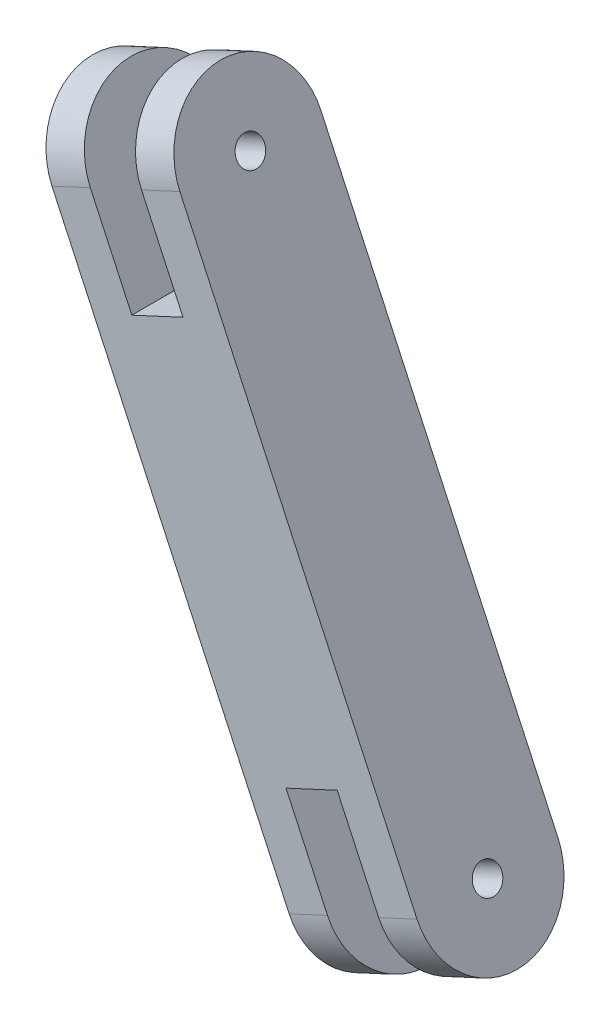
ISO-10303-21;
HEADER;
FILE_DESCRIPTION(('STEP AP214'),'2;1');
FILE_NAME('part.step','',(''),(''),'','','');
FILE_SCHEMA(('AUTOMOTIVE_DESIGN { 1 0 10303 214 1 1 1 1 }'));
ENDSEC;
DATA;
#1=APPLICATION_CONTEXT('core data for automotive mechanical design processes');
#2=APPLICATION_PROTOCOL_DEFINITION('international standard','automotive_design',2000,#1);
#3=PRODUCT_CONTEXT('',#1,'mechanical');
#4=PRODUCT('Part','Part','',(#3));
#5=PRODUCT_RELATED_PRODUCT_CATEGORY('part','',(#4));
#6=PRODUCT_DEFINITION_FORMATION('','',#4);
#7=PRODUCT_DEFINITION_CONTEXT('part definition',#1,'design');
#8=PRODUCT_DEFINITION('design','',#6,#7);
#9=PRODUCT_DEFINITION_SHAPE('','',#8);
#10=(LENGTH_UNIT() NAMED_UNIT(*) SI_UNIT(.MILLI.,.METRE.));
#11=(NAMED_UNIT(*) PLANE_ANGLE_UNIT() SI_UNIT($,.RADIAN.));
#12=(NAMED_UNIT(*) SI_UNIT($,.STERADIAN.) SOLID_ANGLE_UNIT());
#13=UNCERTAINTY_MEASURE_WITH_UNIT(LENGTH_MEASURE(1.E-05),#10,'distance_accuracy_value','');
#14=(GEOMETRIC_REPRESENTATION_CONTEXT(3) GLOBAL_UNCERTAINTY_ASSIGNED_CONTEXT((#13)) GLOBAL_UNIT_ASSIGNED_CONTEXT((#10,
#11,#12)) REPRESENTATION_CONTEXT('',''));
#15=CARTESIAN_POINT('',(0.,0.,0.));
#16=DIRECTION('',(0.,0.,1.));
#17=DIRECTION('',(1.,0.,0.));
#18=AXIS2_PLACEMENT_3D('',#15,#16,#17);
#19=CARTESIAN_POINT('',(-32.9102927291765,-15.2557675524765,10.));
#20=DIRECTION('',(0.907261631256998,0.420566680145837,0.));
#21=DIRECTION('',(-0.420566680145837,0.907261631256998,0.));
#22=AXIS2_PLACEMENT_3D('',#19,#20,#21);
#23=PLANE('',#22);
#24=CARTESIAN_POINT('',(-76.5968103404027,78.9863659854316,5.00000000000001));
#25=DIRECTION('',(0.907261631256998,0.420566680145837,0.));
#26=DIRECTION('',(-0.420566680145837,0.907261631256998,0.));
#27=AXIS2_PLACEMENT_3D('',#24,#25,#26);
#28=CIRCLE('',#27,1.);
#29=CARTESIAN_POINT('',(-77.0173770205486,79.8936276166886,5.00000000000001));
#30=VERTEX_POINT('',#29);
#31=EDGE_CURVE('E230',#30,#30,#28,.T.);
#32=ORIENTED_EDGE('',*,*,#31,.T.);
#33=EDGE_LOOP('',(#32));
#34=FACE_BOUND('',#33,.T.);
#35=CARTESIAN_POINT('',(-76.5968103404027,78.9863659854316,5.00000000000001));
#36=DIRECTION('',(0.907261631256998,0.420566680145837,0.));
#37=DIRECTION('',(-0.420566680145837,0.907261631256998,0.));
#38=AXIS2_PLACEMENT_3D('',#35,#36,#37);
#39=CIRCLE('',#38,5.);
#40=CARTESIAN_POINT('',(-76.5968103404028,78.9863659854317,10.));
#41=VERTEX_POINT('',#40);
#42=CARTESIAN_POINT('',(-76.5968103404027,78.9863659854316,0.));
#43=VERTEX_POINT('',#42);
#44=EDGE_CURVE('E120',#41,#43,#39,.T.);
#45=ORIENTED_EDGE('',*,*,#44,.F.);
#46=DIRECTION('',(0.420566680145837,-0.907261631256998,0.));
#47=VECTOR('',#46,1.);
#48=CARTESIAN_POINT('',(-32.9102927291765,-15.2557675524765,10.));
#49=LINE('',#48,#47);
#50=CARTESIAN_POINT('',(-79.5407771014236,85.3371974042306,10.));
#51=VERTEX_POINT('',#50);
#52=EDGE_CURVE('E293',#51,#41,#49,.T.);
#53=ORIENTED_EDGE('',*,*,#52,.F.);
#54=DIRECTION('',(0.,0.,-1.));
#55=VECTOR('',#54,1.);
#56=CARTESIAN_POINT('',(-79.5407771014236,85.3371974042306,10.));
#57=LINE('',#56,#55);
#58=CARTESIAN_POINT('',(-79.5407771014236,85.3371974042306,0.));
#59=VERTEX_POINT('',#58);
#60=EDGE_CURVE('E256',#51,#59,#57,.T.);
#61=ORIENTED_EDGE('',*,*,#60,.T.);
#62=DIRECTION('',(0.420566680145837,-0.907261631256998,0.));
#63=VECTOR('',#62,1.);
#64=CARTESIAN_POINT('',(-32.9102927291765,-15.2557675524765,0.));
#65=LINE('',#64,#63);
#66=EDGE_CURVE('E229',#59,#43,#65,.T.);
#67=ORIENTED_EDGE('',*,*,#66,.T.);
#68=EDGE_LOOP('',(#45,#53,#61,#67));
#69=FACE_BOUND('',#68,.T.);
#70=ADVANCED_FACE('F105',(#34,#69),#23,.F.);
#71=CARTESIAN_POINT('',(-30.1885078354055,-13.994067512039,10.));
#72=DIRECTION('',(0.907261631256998,0.420566680145837,0.));
#73=DIRECTION('',(-0.420566680145837,0.907261631256998,0.));
#74=AXIS2_PLACEMENT_3D('',#71,#72,#73);
#75=PLANE('',#74);
#76=CARTESIAN_POINT('',(-90.6976926524652,116.538531276149,5.));
#77=DIRECTION('',(0.907261631256998,0.420566680145837,0.));
#78=DIRECTION('',(-0.420566680145837,0.907261631256998,0.));
#79=AXIS2_PLACEMENT_3D('',#76,#77,#78);
#80=CIRCLE('',#79,0.999999999999995);
#81=CARTESIAN_POINT('',(-91.1182593326111,117.445792907406,5.));
#82=VERTEX_POINT('',#81);
#83=EDGE_CURVE('E314',#82,#82,#80,.T.);
#84=ORIENTED_EDGE('',*,*,#83,.F.);
#85=EDGE_LOOP('',(#84));
#86=FACE_BOUND('',#85,.T.);
#87=CARTESIAN_POINT('',(-73.8750254466317,80.2480660258691,5.00000000000001));
#88=DIRECTION('',(0.907261631256998,0.420566680145837,0.));
#89=DIRECTION('',(-0.420566680145837,0.907261631256998,0.));
#90=AXIS2_PLACEMENT_3D('',#87,#88,#89);
#91=CIRCLE('',#90,1.);
#92=CARTESIAN_POINT('',(-74.2955921267776,81.1553276571261,5.00000000000001));
#93=VERTEX_POINT('',#92);
#94=EDGE_CURVE('E267',#93,#93,#91,.T.);
#95=ORIENTED_EDGE('',*,*,#94,.F.);
#96=EDGE_LOOP('',(#95));
#97=FACE_BOUND('',#96,.T.);
#98=CARTESIAN_POINT('',(-90.6976926524652,116.538531276149,5.));
#99=DIRECTION('',(0.907261631256998,0.420566680145837,0.));
#100=DIRECTION('',(-0.420566680145837,0.907261631256998,0.));
#101=AXIS2_PLACEMENT_3D('',#98,#99,#100);
#102=CIRCLE('',#101,5.);
#103=CARTESIAN_POINT('',(-90.6976926524652,116.538531276149,0.));
#104=VERTEX_POINT('',#103);
#105=CARTESIAN_POINT('',(-90.6976926524652,116.538531276149,10.));
#106=VERTEX_POINT('',#105);
#107=EDGE_CURVE('E128',#104,#106,#102,.T.);
#108=ORIENTED_EDGE('',*,*,#107,.T.);
#109=DIRECTION('',(0.420566680145837,-0.907261631256998,0.));
#110=VECTOR('',#109,1.);
#111=CARTESIAN_POINT('',(-30.1885078354055,-13.994067512039,10.));
#112=LINE('',#111,#110);
#113=CARTESIAN_POINT('',(-73.8750254466317,80.2480660258692,10.));
#114=VERTEX_POINT('',#113);
#115=EDGE_CURVE('E290',#106,#114,#112,.T.);
#116=ORIENTED_EDGE('',*,*,#115,.T.);
#117=CARTESIAN_POINT('',(-73.8750254466317,80.2480660258691,5.00000000000001));
#118=DIRECTION('',(0.907261631256998,0.420566680145837,0.));
#119=DIRECTION('',(-0.420566680145837,0.907261631256998,0.));
#120=AXIS2_PLACEMENT_3D('',#117,#118,#119);
#121=CIRCLE('',#120,5.);
#122=CARTESIAN_POINT('',(-73.8750254466317,80.2480660258692,0.));
#123=VERTEX_POINT('',#122);
#124=EDGE_CURVE('E307',#114,#123,#121,.T.);
#125=ORIENTED_EDGE('',*,*,#124,.T.);
#126=DIRECTION('',(0.420566680145837,-0.907261631256998,0.));
#127=VECTOR('',#126,1.);
#128=CARTESIAN_POINT('',(-30.1885078354055,-13.994067512039,0.));
#129=LINE('',#128,#127);
#130=EDGE_CURVE('E233',#104,#123,#129,.T.);
#131=ORIENTED_EDGE('',*,*,#130,.F.);
#132=EDGE_LOOP('',(#108,#116,#125,#131));
#133=FACE_BOUND('',#132,.T.);
#134=ADVANCED_FACE('F359',(#86,#97,#133),#75,.T.);
#135=CARTESIAN_POINT('',(-32.9102927291764,-15.2557675524765,10.));
#136=DIRECTION('',(-0.907261631256998,-0.420566680145837,0.));
#137=DIRECTION('',(0.420566680145837,-0.907261631256998,0.));
#138=AXIS2_PLACEMENT_3D('',#135,#136,#137);
#139=PLANE('',#138);
#140=CARTESIAN_POINT('',(-93.4194775462362,115.276831235712,5.));
#141=DIRECTION('',(-0.907261631256998,-0.420566680145837,0.));
#142=DIRECTION('',(0.420566680145837,-0.907261631256998,0.));
#143=AXIS2_PLACEMENT_3D('',#140,#141,#142);
#144=CIRCLE('',#143,0.999999999999995);
#145=CARTESIAN_POINT('',(-92.9989108660904,114.369569604455,5.));
#146=VERTEX_POINT('',#145);
#147=EDGE_CURVE('E318',#146,#146,#144,.T.);
#148=ORIENTED_EDGE('',*,*,#147,.F.);
#149=EDGE_LOOP('',(#148));
#150=FACE_BOUND('',#149,.T.);
#151=DIRECTION('',(-0.420566680145837,0.907261631256998,0.));
#152=VECTOR('',#151,1.);
#153=CARTESIAN_POINT('',(-32.9102927291764,-15.2557675524765,10.));
#154=LINE('',#153,#152);
#155=CARTESIAN_POINT('',(-90.4755107852153,108.925999816913,10.));
#156=VERTEX_POINT('',#155);
#157=CARTESIAN_POINT('',(-93.4194775462362,115.276831235712,10.));
#158=VERTEX_POINT('',#157);
#159=EDGE_CURVE('E280',#156,#158,#154,.T.);
#160=ORIENTED_EDGE('',*,*,#159,.T.);
#161=CARTESIAN_POINT('',(-93.4194775462362,115.276831235712,5.));
#162=DIRECTION('',(-0.907261631256998,-0.420566680145837,0.));
#163=DIRECTION('',(0.420566680145837,-0.907261631256998,0.));
#164=AXIS2_PLACEMENT_3D('',#161,#162,#163);
#165=CIRCLE('',#164,5.);
#166=CARTESIAN_POINT('',(-93.4194775462362,115.276831235712,0.));
#167=VERTEX_POINT('',#166);
#168=EDGE_CURVE('E272',#158,#167,#165,.T.);
#169=ORIENTED_EDGE('',*,*,#168,.T.);
#170=DIRECTION('',(-0.420566680145837,0.907261631256998,0.));
#171=VECTOR('',#170,1.);
#172=CARTESIAN_POINT('',(-32.9102927291764,-15.2557675524765,0.));
#173=LINE('',#172,#171);
#174=CARTESIAN_POINT('',(-90.4755107852153,108.925999816913,0.));
#175=VERTEX_POINT('',#174);
#176=EDGE_CURVE('E236',#175,#167,#173,.T.);
#177=ORIENTED_EDGE('',*,*,#176,.F.);
#178=DIRECTION('',(0.,0.,-1.));
#179=VECTOR('',#178,1.);
#180=CARTESIAN_POINT('',(-90.4755107852153,108.925999816913,10.));
#181=LINE('',#180,#179);
#182=EDGE_CURVE('E254',#156,#175,#181,.T.);
#183=ORIENTED_EDGE('',*,*,#182,.F.);
#184=EDGE_LOOP('',(#160,#169,#177,#183));
#185=FACE_BOUND('',#184,.T.);
#186=ADVANCED_FACE('F278',(#150,#185),#139,.T.);
#187=CARTESIAN_POINT('',(-36.5393392542046,-16.9380342730599,10.));
#188=DIRECTION('',(0.907261631256998,0.420566680145837,0.));
#189=DIRECTION('',(-0.420566680145837,0.907261631256998,0.));
#190=AXIS2_PLACEMENT_3D('',#187,#188,#189);
#191=PLANE('',#190);
#192=CARTESIAN_POINT('',(-97.0485240712642,113.594564515128,5.));
#193=DIRECTION('',(0.907261631256998,0.420566680145837,0.));
#194=DIRECTION('',(-0.420566680145837,0.907261631256998,0.));
#195=AXIS2_PLACEMENT_3D('',#192,#193,#194);
#196=CIRCLE('',#195,0.999999999999995);
#197=CARTESIAN_POINT('',(-97.4690907514101,114.501826146385,5.));
#198=VERTEX_POINT('',#197);
#199=EDGE_CURVE('E321',#198,#198,#196,.T.);
#200=ORIENTED_EDGE('',*,*,#199,.F.);
#201=EDGE_LOOP('',(#200));
#202=FACE_BOUND('',#201,.T.);
#203=CARTESIAN_POINT('',(-97.0485240712642,113.594564515128,5.));
#204=DIRECTION('',(0.907261631256998,0.420566680145837,0.));
#205=DIRECTION('',(-0.420566680145837,0.907261631256998,0.));
#206=AXIS2_PLACEMENT_3D('',#203,#204,#205);
#207=CIRCLE('',#206,5.);
#208=CARTESIAN_POINT('',(-97.0485240712642,113.594564515128,0.));
#209=VERTEX_POINT('',#208);
#210=CARTESIAN_POINT('',(-97.0485240712642,113.594564515128,10.));
#211=VERTEX_POINT('',#210);
#212=EDGE_CURVE('E281',#209,#211,#207,.T.);
#213=ORIENTED_EDGE('',*,*,#212,.T.);
#214=DIRECTION('',(0.420566680145837,-0.907261631256999,0.));
#215=VECTOR('',#214,1.);
#216=CARTESIAN_POINT('',(-36.5393392542046,-16.9380342730599,10.));
#217=LINE('',#216,#215);
#218=CARTESIAN_POINT('',(-94.1045573102434,107.243733096329,10.));
#219=VERTEX_POINT('',#218);
#220=EDGE_CURVE('E214',#211,#219,#217,.T.);
#221=ORIENTED_EDGE('',*,*,#220,.T.);
#222=DIRECTION('',(0.,0.,-1.));
#223=VECTOR('',#222,1.);
#224=CARTESIAN_POINT('',(-94.1045573102434,107.243733096329,10.));
#225=LINE('',#224,#223);
#226=CARTESIAN_POINT('',(-94.1045573102434,107.243733096329,0.));
#227=VERTEX_POINT('',#226);
#228=EDGE_CURVE('E251',#219,#227,#225,.T.);
#229=ORIENTED_EDGE('',*,*,#228,.T.);
#230=DIRECTION('',(0.420566680145837,-0.907261631256999,0.));
#231=VECTOR('',#230,1.);
#232=CARTESIAN_POINT('',(-36.5393392542046,-16.9380342730599,0.));
#233=LINE('',#232,#231);
#234=EDGE_CURVE('E242',#209,#227,#233,.T.);
#235=ORIENTED_EDGE('',*,*,#234,.F.);
#236=EDGE_LOOP('',(#213,#221,#229,#235));
#237=FACE_BOUND('',#236,.T.);
#238=ADVANCED_FACE('F333',(#202,#237),#191,.T.);
#239=CARTESIAN_POINT('',(-39.2611241479755,-18.1997343134974,10.));
#240=DIRECTION('',(0.907261631256998,0.420566680145837,0.));
#241=DIRECTION('',(-0.420566680145837,0.907261631256998,0.));
#242=AXIS2_PLACEMENT_3D('',#239,#240,#241);
#243=PLANE('',#242);
#244=CARTESIAN_POINT('',(-99.7703089650352,112.332864474691,5.));
#245=DIRECTION('',(-0.907261631256998,-0.420566680145837,0.));
#246=DIRECTION('',(0.420566680145837,-0.907261631256998,0.));
#247=AXIS2_PLACEMENT_3D('',#244,#245,#246);
#248=CIRCLE('',#247,0.999999999999995);
#249=CARTESIAN_POINT('',(-99.3497422848894,111.425602843434,5.));
#250=VERTEX_POINT('',#249);
#251=EDGE_CURVE('E324',#250,#250,#248,.T.);
#252=ORIENTED_EDGE('',*,*,#251,.F.);
#253=EDGE_LOOP('',(#252));
#254=FACE_BOUND('',#253,.T.);
#255=CARTESIAN_POINT('',(-82.9476417592017,76.0423992244108,5.00000000000001));
#256=DIRECTION('',(-0.907261631256998,-0.420566680145837,0.));
#257=DIRECTION('',(0.420566680145837,-0.907261631256998,0.));
#258=AXIS2_PLACEMENT_3D('',#255,#256,#257);
#259=CIRCLE('',#258,1.);
#260=CARTESIAN_POINT('',(-82.5270750790559,75.1351375931538,5.00000000000001));
#261=VERTEX_POINT('',#260);
#262=EDGE_CURVE('E312',#261,#261,#259,.T.);
#263=ORIENTED_EDGE('',*,*,#262,.F.);
#264=EDGE_LOOP('',(#263));
#265=FACE_BOUND('',#264,.T.);
#266=DIRECTION('',(0.420566680145837,-0.907261631256998,0.));
#267=VECTOR('',#266,1.);
#268=CARTESIAN_POINT('',(-39.2611241479755,-18.1997343134974,10.));
#269=LINE('',#268,#267);
#270=CARTESIAN_POINT('',(-99.7703089650352,112.332864474691,10.));
#271=VERTEX_POINT('',#270);
#272=CARTESIAN_POINT('',(-82.9476417592017,76.0423992244108,10.));
#273=VERTEX_POINT('',#272);
#274=EDGE_CURVE('E212',#271,#273,#269,.T.);
#275=ORIENTED_EDGE('',*,*,#274,.F.);
#276=CARTESIAN_POINT('',(-99.7703089650352,112.332864474691,5.));
#277=DIRECTION('',(-0.907261631256998,-0.420566680145837,0.));
#278=DIRECTION('',(0.420566680145837,-0.907261631256998,0.));
#279=AXIS2_PLACEMENT_3D('',#276,#277,#278);
#280=CIRCLE('',#279,5.);
#281=CARTESIAN_POINT('',(-99.7703089650352,112.332864474691,0.));
#282=VERTEX_POINT('',#281);
#283=EDGE_CURVE('E194',#271,#282,#280,.T.);
#284=ORIENTED_EDGE('',*,*,#283,.T.);
#285=DIRECTION('',(0.420566680145837,-0.907261631256998,0.));
#286=VECTOR('',#285,1.);
#287=CARTESIAN_POINT('',(-39.2611241479755,-18.1997343134974,0.));
#288=LINE('',#287,#286);
#289=CARTESIAN_POINT('',(-82.9476417592017,76.0423992244108,0.));
#290=VERTEX_POINT('',#289);
#291=EDGE_CURVE('E244',#282,#290,#288,.T.);
#292=ORIENTED_EDGE('',*,*,#291,.T.);
#293=CARTESIAN_POINT('',(-82.9476417592017,76.0423992244108,5.00000000000001));
#294=DIRECTION('',(-0.907261631256998,-0.420566680145837,0.));
#295=DIRECTION('',(0.420566680145837,-0.907261631256998,0.));
#296=AXIS2_PLACEMENT_3D('',#293,#294,#295);
#297=CIRCLE('',#296,5.);
#298=EDGE_CURVE('E205',#290,#273,#297,.T.);
#299=ORIENTED_EDGE('',*,*,#298,.T.);
#300=EDGE_LOOP('',(#275,#284,#292,#299));
#301=FACE_BOUND('',#300,.T.);
#302=ADVANCED_FACE('F216',(#254,#265,#301),#243,.F.);
#303=CARTESIAN_POINT('',(-36.5393392542047,-16.9380342730599,10.));
#304=DIRECTION('',(-0.907261631256999,-0.420566680145836,0.));
#305=DIRECTION('',(0.420566680145836,-0.907261631256999,0.));
#306=AXIS2_PLACEMENT_3D('',#303,#304,#305);
#307=PLANE('',#306);
#308=CARTESIAN_POINT('',(-80.2258568654308,77.3040992648483,5.00000000000001));
#309=DIRECTION('',(-0.907261631256999,-0.420566680145836,0.));
#310=DIRECTION('',(0.420566680145836,-0.907261631256999,0.));
#311=AXIS2_PLACEMENT_3D('',#308,#309,#310);
#312=CIRCLE('',#311,1.);
#313=CARTESIAN_POINT('',(-79.8052901852849,76.3968376335913,5.00000000000001));
#314=VERTEX_POINT('',#313);
#315=EDGE_CURVE('E265',#314,#314,#312,.T.);
#316=ORIENTED_EDGE('',*,*,#315,.T.);
#317=EDGE_LOOP('',(#316));
#318=FACE_BOUND('',#317,.T.);
#319=DIRECTION('',(-0.420566680145836,0.907261631256999,0.));
#320=VECTOR('',#319,1.);
#321=CARTESIAN_POINT('',(-36.5393392542047,-16.9380342730599,10.));
#322=LINE('',#321,#320);
#323=CARTESIAN_POINT('',(-80.2258568654308,77.3040992648483,10.));
#324=VERTEX_POINT('',#323);
#325=CARTESIAN_POINT('',(-83.1698236264516,83.6549306836473,10.));
#326=VERTEX_POINT('',#325);
#327=EDGE_CURVE('E218',#324,#326,#322,.T.);
#328=ORIENTED_EDGE('',*,*,#327,.F.);
#329=CARTESIAN_POINT('',(-80.2258568654308,77.3040992648483,5.00000000000001));
#330=DIRECTION('',(-0.907261631256999,-0.420566680145836,0.));
#331=DIRECTION('',(0.420566680145836,-0.907261631256999,0.));
#332=AXIS2_PLACEMENT_3D('',#329,#330,#331);
#333=CIRCLE('',#332,5.);
#334=CARTESIAN_POINT('',(-80.2258568654308,77.3040992648483,0.));
#335=VERTEX_POINT('',#334);
#336=EDGE_CURVE('E204',#335,#324,#333,.T.);
#337=ORIENTED_EDGE('',*,*,#336,.F.);
#338=DIRECTION('',(-0.420566680145836,0.907261631256999,0.));
#339=VECTOR('',#338,1.);
#340=CARTESIAN_POINT('',(-36.5393392542047,-16.9380342730599,0.));
#341=LINE('',#340,#339);
#342=CARTESIAN_POINT('',(-83.1698236264516,83.6549306836473,0.));
#343=VERTEX_POINT('',#342);
#344=EDGE_CURVE('E246',#335,#343,#341,.T.);
#345=ORIENTED_EDGE('',*,*,#344,.T.);
#346=DIRECTION('',(0.,0.,-1.));
#347=VECTOR('',#346,1.);
#348=CARTESIAN_POINT('',(-83.1698236264516,83.6549306836473,10.));
#349=LINE('',#348,#347);
#350=EDGE_CURVE('E220',#326,#343,#349,.T.);
#351=ORIENTED_EDGE('',*,*,#350,.F.);
#352=EDGE_LOOP('',(#328,#337,#345,#351));
#353=FACE_BOUND('',#352,.T.);
#354=ADVANCED_FACE('F332',(#318,#353),#307,.F.);
#355=CARTESIAN_POINT('',(0.,0.,10.));
#356=DIRECTION('',(0.,0.,1.));
#357=DIRECTION('',(1.,0.,0.));
#358=AXIS2_PLACEMENT_3D('',#355,#356,#357);
#359=PLANE('',#358);
#360=ORIENTED_EDGE('',*,*,#115,.F.);
#361=DIRECTION('',(-0.907261631256998,-0.420566680145837,0.));
#362=VECTOR('',#361,1.);
#363=CARTESIAN_POINT('',(-81.6250763398952,120.744198077607,10.));
#364=LINE('',#363,#362);
#365=EDGE_CURVE('E12',#106,#158,#364,.T.);
#366=ORIENTED_EDGE('',*,*,#365,.T.);
#367=ORIENTED_EDGE('',*,*,#159,.F.);
#368=DIRECTION('',(0.907261631256998,0.420566680145837,0.));
#369=VECTOR('',#368,1.);
#370=CARTESIAN_POINT('',(-57.5652180560388,124.181767369389,10.));
#371=LINE('',#370,#369);
#372=EDGE_CURVE('E222',#219,#156,#371,.T.);
#373=ORIENTED_EDGE('',*,*,#372,.F.);
#374=ORIENTED_EDGE('',*,*,#220,.F.);
#375=EDGE_CURVE('E109',#211,#271,#364,.T.);
#376=ORIENTED_EDGE('',*,*,#375,.T.);
#377=ORIENTED_EDGE('',*,*,#274,.T.);
#378=DIRECTION('',(-0.907261631256998,-0.420566680145837,0.));
#379=VECTOR('',#378,1.);
#380=CARTESIAN_POINT('',(-64.8024091340617,84.4537328273275,10.));
#381=LINE('',#380,#379);
#382=EDGE_CURVE('E268',#324,#273,#381,.T.);
#383=ORIENTED_EDGE('',*,*,#382,.F.);
#384=ORIENTED_EDGE('',*,*,#327,.T.);
#385=DIRECTION('',(0.907261631256998,0.420566680145838,0.));
#386=VECTOR('',#385,1.);
#387=CARTESIAN_POINT('',(-46.6304843722472,100.592964956707,10.));
#388=LINE('',#387,#386);
#389=EDGE_CURVE('E248',#326,#51,#388,.T.);
#390=ORIENTED_EDGE('',*,*,#389,.T.);
#391=ORIENTED_EDGE('',*,*,#52,.T.);
#392=EDGE_CURVE('E215',#114,#41,#381,.T.);
#393=ORIENTED_EDGE('',*,*,#392,.F.);
#394=EDGE_LOOP('',(#360,#366,#367,#373,#374,#376,#377,#383,#384,#390,#391,#393));
#395=FACE_BOUND('',#394,.T.);
#396=ADVANCED_FACE('F210',(#395),#359,.T.);
#397=CARTESIAN_POINT('',(0.,0.,0.));
#398=DIRECTION('',(0.,0.,1.));
#399=DIRECTION('',(1.,0.,0.));
#400=AXIS2_PLACEMENT_3D('',#397,#398,#399);
#401=PLANE('',#400);
#402=DIRECTION('',(-0.907261631256998,-0.420566680145837,0.));
#403=VECTOR('',#402,1.);
#404=CARTESIAN_POINT('',(-81.6250763398952,120.744198077607,0.));
#405=LINE('',#404,#403);
#406=EDGE_CURVE('E264',#104,#167,#405,.T.);
#407=ORIENTED_EDGE('',*,*,#406,.F.);
#408=ORIENTED_EDGE('',*,*,#130,.T.);
#409=DIRECTION('',(-0.907261631256998,-0.420566680145837,0.));
#410=VECTOR('',#409,1.);
#411=CARTESIAN_POINT('',(-64.8024091340617,84.4537328273275,0.));
#412=LINE('',#411,#410);
#413=EDGE_CURVE('E262',#123,#43,#412,.T.);
#414=ORIENTED_EDGE('',*,*,#413,.T.);
#415=ORIENTED_EDGE('',*,*,#66,.F.);
#416=DIRECTION('',(0.907261631256998,0.420566680145838,0.));
#417=VECTOR('',#416,1.);
#418=CARTESIAN_POINT('',(-46.6304843722472,100.592964956707,0.));
#419=LINE('',#418,#417);
#420=EDGE_CURVE('E226',#343,#59,#419,.T.);
#421=ORIENTED_EDGE('',*,*,#420,.F.);
#422=ORIENTED_EDGE('',*,*,#344,.F.);
#423=EDGE_CURVE('E259',#335,#290,#412,.T.);
#424=ORIENTED_EDGE('',*,*,#423,.T.);
#425=ORIENTED_EDGE('',*,*,#291,.F.);
#426=EDGE_CURVE('E199',#209,#282,#405,.T.);
#427=ORIENTED_EDGE('',*,*,#426,.F.);
#428=ORIENTED_EDGE('',*,*,#234,.T.);
#429=DIRECTION('',(0.907261631256998,0.420566680145837,0.));
#430=VECTOR('',#429,1.);
#431=CARTESIAN_POINT('',(-57.5652180560388,124.181767369389,0.));
#432=LINE('',#431,#430);
#433=EDGE_CURVE('E239',#227,#175,#432,.T.);
#434=ORIENTED_EDGE('',*,*,#433,.T.);
#435=ORIENTED_EDGE('',*,*,#176,.T.);
#436=EDGE_LOOP('',(#407,#408,#414,#415,#421,#422,#424,#425,#427,#428,#434,#435));
#437=FACE_BOUND('',#436,.T.);
#438=ADVANCED_FACE('F283',(#437),#401,.F.);
#439=CARTESIAN_POINT('',(-46.6304843722472,100.592964956707,10.));
#440=DIRECTION('',(-0.420566680145838,0.907261631256998,0.));
#441=DIRECTION('',(-0.907261631256998,-0.420566680145838,0.));
#442=AXIS2_PLACEMENT_3D('',#439,#440,#441);
#443=PLANE('',#442);
#444=ORIENTED_EDGE('',*,*,#420,.T.);
#445=ORIENTED_EDGE('',*,*,#60,.F.);
#446=ORIENTED_EDGE('',*,*,#389,.F.);
#447=ORIENTED_EDGE('',*,*,#350,.T.);
#448=EDGE_LOOP('',(#444,#445,#446,#447));
#449=FACE_BOUND('',#448,.T.);
#450=ADVANCED_FACE('F107',(#449),#443,.F.);
#451=CARTESIAN_POINT('',(-57.5652180560388,124.181767369389,10.));
#452=DIRECTION('',(-0.420566680145837,0.907261631256998,0.));
#453=DIRECTION('',(-0.907261631256998,-0.420566680145837,0.));
#454=AXIS2_PLACEMENT_3D('',#451,#452,#453);
#455=PLANE('',#454);
#456=ORIENTED_EDGE('',*,*,#433,.F.);
#457=ORIENTED_EDGE('',*,*,#228,.F.);
#458=ORIENTED_EDGE('',*,*,#372,.T.);
#459=ORIENTED_EDGE('',*,*,#182,.T.);
#460=EDGE_LOOP('',(#456,#457,#458,#459));
#461=FACE_BOUND('',#460,.T.);
#462=ADVANCED_FACE('F288',(#461),#455,.T.);
#463=CARTESIAN_POINT('',(-64.8024091340617,84.4537328273275,5.00000000000001));
#464=DIRECTION('',(-0.907261631256998,-0.420566680145837,0.));
#465=DIRECTION('',(0.420566680145837,-0.907261631256998,0.));
#466=AXIS2_PLACEMENT_3D('',#463,#464,#465);
#467=CYLINDRICAL_SURFACE('',#466,5.);
#468=ORIENTED_EDGE('',*,*,#336,.T.);
#469=ORIENTED_EDGE('',*,*,#382,.T.);
#470=ORIENTED_EDGE('',*,*,#298,.F.);
#471=ORIENTED_EDGE('',*,*,#423,.F.);
#472=EDGE_LOOP('',(#468,#469,#470,#471));
#473=FACE_BOUND('',#472,.T.);
#474=ADVANCED_FACE('F360',(#473),#467,.T.);
#475=ORIENTED_EDGE('',*,*,#44,.T.);
#476=ORIENTED_EDGE('',*,*,#413,.F.);
#477=ORIENTED_EDGE('',*,*,#124,.F.);
#478=ORIENTED_EDGE('',*,*,#392,.T.);
#479=EDGE_LOOP('',(#475,#476,#477,#478));
#480=FACE_BOUND('',#479,.T.);
#481=ADVANCED_FACE('F357',(#480),#467,.T.);
#482=CARTESIAN_POINT('',(-81.6250763398952,120.744198077607,5.));
#483=DIRECTION('',(-0.907261631256998,-0.420566680145837,0.));
#484=DIRECTION('',(0.420566680145837,-0.907261631256998,0.));
#485=AXIS2_PLACEMENT_3D('',#482,#483,#484);
#486=CYLINDRICAL_SURFACE('',#485,5.);
#487=ORIENTED_EDGE('',*,*,#426,.T.);
#488=ORIENTED_EDGE('',*,*,#283,.F.);
#489=ORIENTED_EDGE('',*,*,#375,.F.);
#490=ORIENTED_EDGE('',*,*,#212,.F.);
#491=EDGE_LOOP('',(#487,#488,#489,#490));
#492=FACE_BOUND('',#491,.T.);
#493=ADVANCED_FACE('F196',(#492),#486,.T.);
#494=ORIENTED_EDGE('',*,*,#406,.T.);
#495=ORIENTED_EDGE('',*,*,#168,.F.);
#496=ORIENTED_EDGE('',*,*,#365,.F.);
#497=ORIENTED_EDGE('',*,*,#107,.F.);
#498=EDGE_LOOP('',(#494,#495,#496,#497));
#499=FACE_BOUND('',#498,.T.);
#500=ADVANCED_FACE('F271',(#499),#486,.T.);
#501=CARTESIAN_POINT('',(-64.8024091340617,84.4537328273275,5.00000000000001));
#502=DIRECTION('',(-0.907261631256998,-0.420566680145837,0.));
#503=DIRECTION('',(0.420566680145837,-0.907261631256998,0.));
#504=AXIS2_PLACEMENT_3D('',#501,#502,#503);
#505=CYLINDRICAL_SURFACE('',#504,1.);
#506=ORIENTED_EDGE('',*,*,#262,.T.);
#507=EDGE_LOOP('',(#506));
#508=FACE_BOUND('',#507,.T.);
#509=ORIENTED_EDGE('',*,*,#315,.F.);
#510=EDGE_LOOP('',(#509));
#511=FACE_BOUND('',#510,.T.);
#512=ADVANCED_FACE('F337',(#508,#511),#505,.F.);
#513=ORIENTED_EDGE('',*,*,#94,.T.);
#514=EDGE_LOOP('',(#513));
#515=FACE_BOUND('',#514,.T.);
#516=ORIENTED_EDGE('',*,*,#31,.F.);
#517=EDGE_LOOP('',(#516));
#518=FACE_BOUND('',#517,.T.);
#519=ADVANCED_FACE('F340',(#515,#518),#505,.F.);
#520=CARTESIAN_POINT('',(-81.6250763398952,120.744198077607,5.));
#521=DIRECTION('',(-0.907261631256998,-0.420566680145837,0.));
#522=DIRECTION('',(0.420566680145837,-0.907261631256998,0.));
#523=AXIS2_PLACEMENT_3D('',#520,#521,#522);
#524=CYLINDRICAL_SURFACE('',#523,0.999999999999995);
#525=ORIENTED_EDGE('',*,*,#199,.T.);
#526=EDGE_LOOP('',(#525));
#527=FACE_BOUND('',#526,.T.);
#528=ORIENTED_EDGE('',*,*,#251,.T.);
#529=EDGE_LOOP('',(#528));
#530=FACE_BOUND('',#529,.T.);
#531=ADVANCED_FACE('F328',(#527,#530),#524,.F.);
#532=ORIENTED_EDGE('',*,*,#83,.T.);
#533=EDGE_LOOP('',(#532));
#534=FACE_BOUND('',#533,.T.);
#535=ORIENTED_EDGE('',*,*,#147,.T.);
#536=EDGE_LOOP('',(#535));
#537=FACE_BOUND('',#536,.T.);
#538=ADVANCED_FACE('F510',(#534,#537),#524,.F.);
#539=CLOSED_SHELL('',(#70,#134,#186,#238,#302,#354,#396,#438,#450,#462,#474,#481,#493,#500,#512,
#519,#531,#538));
#540=MANIFOLD_SOLID_BREP('B2',#539);
#541=ADVANCED_BREP_SHAPE_REPRESENTATION('',(#18,#540),#14);
#542=SHAPE_DEFINITION_REPRESENTATION(#9,#541);
ENDSEC;
END-ISO-10303-21;
